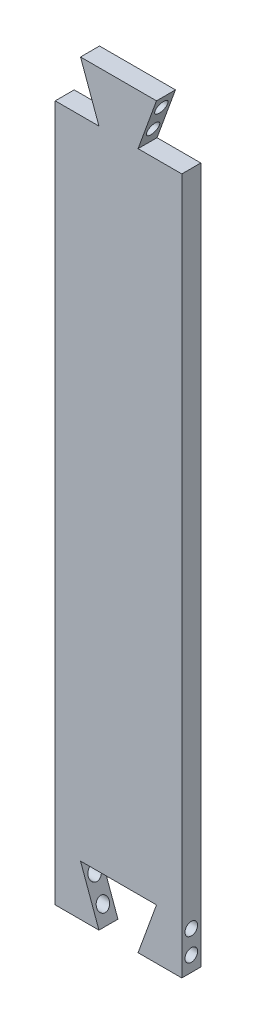
ISO-10303-21;
HEADER;
FILE_DESCRIPTION(('STEP AP214'),'2;1');
FILE_NAME('part.step','',(''),(''),'','','');
FILE_SCHEMA(('AUTOMOTIVE_DESIGN { 1 0 10303 214 1 1 1 1 }'));
ENDSEC;
DATA;
#1=APPLICATION_CONTEXT('core data for automotive mechanical design processes');
#2=APPLICATION_PROTOCOL_DEFINITION('international standard','automotive_design',2000,#1);
#3=PRODUCT_CONTEXT('',#1,'mechanical');
#4=PRODUCT('Part','Part','',(#3));
#5=PRODUCT_RELATED_PRODUCT_CATEGORY('part','',(#4));
#6=PRODUCT_DEFINITION_FORMATION('','',#4);
#7=PRODUCT_DEFINITION_CONTEXT('part definition',#1,'design');
#8=PRODUCT_DEFINITION('design','',#6,#7);
#9=PRODUCT_DEFINITION_SHAPE('','',#8);
#10=(LENGTH_UNIT() NAMED_UNIT(*) SI_UNIT(.MILLI.,.METRE.));
#11=(NAMED_UNIT(*) PLANE_ANGLE_UNIT() SI_UNIT($,.RADIAN.));
#12=(NAMED_UNIT(*) SI_UNIT($,.STERADIAN.) SOLID_ANGLE_UNIT());
#13=UNCERTAINTY_MEASURE_WITH_UNIT(LENGTH_MEASURE(1.E-05),#10,'distance_accuracy_value','');
#14=(GEOMETRIC_REPRESENTATION_CONTEXT(3) GLOBAL_UNCERTAINTY_ASSIGNED_CONTEXT((#13)) GLOBAL_UNIT_ASSIGNED_CONTEXT((#10,
#11,#12)) REPRESENTATION_CONTEXT('',''));
#15=CARTESIAN_POINT('',(0.,0.,0.));
#16=DIRECTION('',(0.,0.,1.));
#17=DIRECTION('',(1.,0.,0.));
#18=AXIS2_PLACEMENT_3D('',#15,#16,#17);
#19=CARTESIAN_POINT('',(0.,-275.,7.5));
#20=DIRECTION('',(0.,1.,0.));
#21=DIRECTION('',(0.,0.,1.));
#22=AXIS2_PLACEMENT_3D('',#19,#20,#21);
#23=PLANE('',#22);
#24=DIRECTION('',(1.,0.,0.));
#25=VECTOR('',#24,1.);
#26=CARTESIAN_POINT('',(0.,-275.,0.));
#27=LINE('',#26,#25);
#28=CARTESIAN_POINT('',(0.,-275.,0.));
#29=VERTEX_POINT('',#28);
#30=CARTESIAN_POINT('',(17.2794046853243,-275.,0.));
#31=VERTEX_POINT('',#30);
#32=EDGE_CURVE('E162',#29,#31,#27,.T.);
#33=ORIENTED_EDGE('',*,*,#32,.T.);
#34=DIRECTION('',(0.,0.,1.));
#35=VECTOR('',#34,1.);
#36=CARTESIAN_POINT('',(17.2794046853243,-275.,-0.00100000000000013));
#37=LINE('',#36,#35);
#38=CARTESIAN_POINT('',(17.2794046853243,-275.,7.5));
#39=VERTEX_POINT('',#38);
#40=EDGE_CURVE('E145',#31,#39,#37,.T.);
#41=ORIENTED_EDGE('',*,*,#40,.T.);
#42=DIRECTION('',(1.,0.,0.));
#43=VECTOR('',#42,1.);
#44=CARTESIAN_POINT('',(0.,-275.,7.5));
#45=LINE('',#44,#43);
#46=CARTESIAN_POINT('',(0.,-275.,7.5));
#47=VERTEX_POINT('',#46);
#48=EDGE_CURVE('E296',#47,#39,#45,.T.);
#49=ORIENTED_EDGE('',*,*,#48,.F.);
#50=DIRECTION('',(0.,0.,-1.));
#51=VECTOR('',#50,1.);
#52=CARTESIAN_POINT('',(0.,-275.,7.5));
#53=LINE('',#52,#51);
#54=EDGE_CURVE('E11',#47,#29,#53,.T.);
#55=ORIENTED_EDGE('',*,*,#54,.T.);
#56=EDGE_LOOP('',(#33,#41,#49,#55));
#57=FACE_BOUND('',#56,.T.);
#58=ADVANCED_FACE('F42',(#57),#23,.F.);
#59=CARTESIAN_POINT('',(0.,0.,7.5));
#60=DIRECTION('',(0.,-1.,0.));
#61=DIRECTION('',(0.,0.,-1.));
#62=AXIS2_PLACEMENT_3D('',#59,#60,#61);
#63=PLANE('',#62);
#64=DIRECTION('',(0.,0.,1.));
#65=VECTOR('',#64,1.);
#66=CARTESIAN_POINT('',(17.279404685324,0.,-36.0555127546398));
#67=LINE('',#66,#65);
#68=CARTESIAN_POINT('',(17.279404685324,0.,0.));
#69=VERTEX_POINT('',#68);
#70=CARTESIAN_POINT('',(17.279404685324,0.,7.5));
#71=VERTEX_POINT('',#70);
#72=EDGE_CURVE('E265',#69,#71,#67,.T.);
#73=ORIENTED_EDGE('',*,*,#72,.F.);
#74=DIRECTION('',(-1.,0.,0.));
#75=VECTOR('',#74,1.);
#76=CARTESIAN_POINT('',(0.,0.,0.));
#77=LINE('',#76,#75);
#78=CARTESIAN_POINT('',(0.,0.,0.));
#79=VERTEX_POINT('',#78);
#80=EDGE_CURVE('E175',#69,#79,#77,.T.);
#81=ORIENTED_EDGE('',*,*,#80,.T.);
#82=DIRECTION('',(0.,0.,-1.));
#83=VECTOR('',#82,1.);
#84=CARTESIAN_POINT('',(0.,0.,7.5));
#85=LINE('',#84,#83);
#86=CARTESIAN_POINT('',(0.,0.,7.5));
#87=VERTEX_POINT('',#86);
#88=EDGE_CURVE('E180',#87,#79,#85,.T.);
#89=ORIENTED_EDGE('',*,*,#88,.F.);
#90=DIRECTION('',(-1.,0.,0.));
#91=VECTOR('',#90,1.);
#92=CARTESIAN_POINT('',(0.,0.,7.5));
#93=LINE('',#92,#91);
#94=EDGE_CURVE('E302',#71,#87,#93,.T.);
#95=ORIENTED_EDGE('',*,*,#94,.F.);
#96=EDGE_LOOP('',(#73,#81,#89,#95));
#97=FACE_BOUND('',#96,.T.);
#98=ADVANCED_FACE('F314',(#97),#63,.F.);
#99=CARTESIAN_POINT('',(0.,0.,7.5));
#100=DIRECTION('',(1.,0.,0.));
#101=DIRECTION('',(0.,1.,0.));
#102=AXIS2_PLACEMENT_3D('',#99,#100,#101);
#103=PLANE('',#102);
#104=CARTESIAN_POINT('',(0.,-269.,3.75));
#105=DIRECTION('',(1.,0.,0.));
#106=DIRECTION('',(0.,1.,0.));
#107=AXIS2_PLACEMENT_3D('',#104,#105,#106);
#108=CIRCLE('',#107,2.5);
#109=CARTESIAN_POINT('',(0.,-266.5,3.75));
#110=VERTEX_POINT('',#109);
#111=EDGE_CURVE('E227',#110,#110,#108,.T.);
#112=ORIENTED_EDGE('',*,*,#111,.T.);
#113=EDGE_LOOP('',(#112));
#114=FACE_BOUND('',#113,.T.);
#115=CARTESIAN_POINT('',(0.,-260.,3.75));
#116=DIRECTION('',(1.,0.,0.));
#117=DIRECTION('',(0.,1.,0.));
#118=AXIS2_PLACEMENT_3D('',#115,#116,#117);
#119=CIRCLE('',#118,2.5);
#120=CARTESIAN_POINT('',(0.,-257.5,3.75));
#121=VERTEX_POINT('',#120);
#122=EDGE_CURVE('E209',#121,#121,#119,.T.);
#123=ORIENTED_EDGE('',*,*,#122,.T.);
#124=EDGE_LOOP('',(#123));
#125=FACE_BOUND('',#124,.T.);
#126=DIRECTION('',(0.,-1.,0.));
#127=VECTOR('',#126,1.);
#128=CARTESIAN_POINT('',(0.,0.,0.));
#129=LINE('',#128,#127);
#130=EDGE_CURVE('E163',#79,#29,#129,.T.);
#131=ORIENTED_EDGE('',*,*,#130,.T.);
#132=ORIENTED_EDGE('',*,*,#54,.F.);
#133=DIRECTION('',(0.,-1.,0.));
#134=VECTOR('',#133,1.);
#135=CARTESIAN_POINT('',(0.,0.,7.5));
#136=LINE('',#135,#134);
#137=EDGE_CURVE('E179',#87,#47,#136,.T.);
#138=ORIENTED_EDGE('',*,*,#137,.F.);
#139=ORIENTED_EDGE('',*,*,#88,.T.);
#140=EDGE_LOOP('',(#131,#132,#138,#139));
#141=FACE_BOUND('',#140,.T.);
#142=ADVANCED_FACE('F44',(#114,#125,#141),#103,.F.);
#143=CARTESIAN_POINT('',(32.7205953146761,-275.,7.5));
#144=VERTEX_POINT('',#143);
#145=CARTESIAN_POINT('',(50.,-275.,7.5));
#146=VERTEX_POINT('',#145);
#147=EDGE_CURVE('E153',#144,#146,#45,.T.);
#148=ORIENTED_EDGE('',*,*,#147,.F.);
#149=DIRECTION('',(0.,0.,1.));
#150=VECTOR('',#149,1.);
#151=CARTESIAN_POINT('',(32.7205953146761,-275.,-0.00100000000000013));
#152=LINE('',#151,#150);
#153=CARTESIAN_POINT('',(32.7205953146761,-275.,0.));
#154=VERTEX_POINT('',#153);
#155=EDGE_CURVE('E138',#154,#144,#152,.T.);
#156=ORIENTED_EDGE('',*,*,#155,.F.);
#157=CARTESIAN_POINT('',(50.,-275.,0.));
#158=VERTEX_POINT('',#157);
#159=EDGE_CURVE('E151',#154,#158,#27,.T.);
#160=ORIENTED_EDGE('',*,*,#159,.T.);
#161=DIRECTION('',(0.,0.,-1.));
#162=VECTOR('',#161,1.);
#163=CARTESIAN_POINT('',(50.,-275.,7.5));
#164=LINE('',#163,#162);
#165=EDGE_CURVE('E52',#146,#158,#164,.T.);
#166=ORIENTED_EDGE('',*,*,#165,.F.);
#167=EDGE_LOOP('',(#148,#156,#160,#166));
#168=FACE_BOUND('',#167,.T.);
#169=ADVANCED_FACE('F149',(#168),#23,.F.);
#170=CARTESIAN_POINT('',(50.,0.,7.5));
#171=DIRECTION('',(-1.,0.,0.));
#172=DIRECTION('',(0.,-1.,0.));
#173=AXIS2_PLACEMENT_3D('',#170,#171,#172);
#174=PLANE('',#173);
#175=CARTESIAN_POINT('',(50.0000000000001,-269.,3.75));
#176=DIRECTION('',(-1.,0.,0.));
#177=DIRECTION('',(0.,-1.,0.));
#178=AXIS2_PLACEMENT_3D('',#175,#176,#177);
#179=CIRCLE('',#178,2.5);
#180=CARTESIAN_POINT('',(50.0000000000001,-271.5,3.75));
#181=VERTEX_POINT('',#180);
#182=EDGE_CURVE('E203',#181,#181,#179,.T.);
#183=ORIENTED_EDGE('',*,*,#182,.T.);
#184=EDGE_LOOP('',(#183));
#185=FACE_BOUND('',#184,.T.);
#186=CARTESIAN_POINT('',(50.0000000000001,-260.,3.75));
#187=DIRECTION('',(-1.,0.,0.));
#188=DIRECTION('',(0.,-1.,0.));
#189=AXIS2_PLACEMENT_3D('',#186,#187,#188);
#190=CIRCLE('',#189,2.5);
#191=CARTESIAN_POINT('',(50.0000000000001,-262.5,3.75));
#192=VERTEX_POINT('',#191);
#193=EDGE_CURVE('E212',#192,#192,#190,.T.);
#194=ORIENTED_EDGE('',*,*,#193,.T.);
#195=EDGE_LOOP('',(#194));
#196=FACE_BOUND('',#195,.T.);
#197=DIRECTION('',(0.,1.,0.));
#198=VECTOR('',#197,1.);
#199=CARTESIAN_POINT('',(50.,0.,0.));
#200=LINE('',#199,#198);
#201=CARTESIAN_POINT('',(50.,0.,0.));
#202=VERTEX_POINT('',#201);
#203=EDGE_CURVE('E160',#158,#202,#200,.T.);
#204=ORIENTED_EDGE('',*,*,#203,.T.);
#205=DIRECTION('',(0.,0.,-1.));
#206=VECTOR('',#205,1.);
#207=CARTESIAN_POINT('',(50.,0.,7.5));
#208=LINE('',#207,#206);
#209=CARTESIAN_POINT('',(50.,0.,7.5));
#210=VERTEX_POINT('',#209);
#211=EDGE_CURVE('E184',#210,#202,#208,.T.);
#212=ORIENTED_EDGE('',*,*,#211,.F.);
#213=DIRECTION('',(0.,1.,0.));
#214=VECTOR('',#213,1.);
#215=CARTESIAN_POINT('',(50.,0.,7.5));
#216=LINE('',#215,#214);
#217=EDGE_CURVE('E300',#146,#210,#216,.T.);
#218=ORIENTED_EDGE('',*,*,#217,.F.);
#219=ORIENTED_EDGE('',*,*,#165,.T.);
#220=EDGE_LOOP('',(#204,#212,#218,#219));
#221=FACE_BOUND('',#220,.T.);
#222=ADVANCED_FACE('F328',(#185,#196,#221),#174,.F.);
#223=CARTESIAN_POINT('',(32.7205953146761,0.,0.));
#224=VERTEX_POINT('',#223);
#225=EDGE_CURVE('E176',#202,#224,#77,.T.);
#226=ORIENTED_EDGE('',*,*,#225,.T.);
#227=DIRECTION('',(0.,0.,1.));
#228=VECTOR('',#227,1.);
#229=CARTESIAN_POINT('',(32.7205953146761,0.,-36.0555127546398));
#230=LINE('',#229,#228);
#231=CARTESIAN_POINT('',(32.7205953146761,0.,7.5));
#232=VERTEX_POINT('',#231);
#233=EDGE_CURVE('E68',#224,#232,#230,.T.);
#234=ORIENTED_EDGE('',*,*,#233,.T.);
#235=EDGE_CURVE('E185',#210,#232,#93,.T.);
#236=ORIENTED_EDGE('',*,*,#235,.F.);
#237=ORIENTED_EDGE('',*,*,#211,.T.);
#238=EDGE_LOOP('',(#226,#234,#236,#237));
#239=FACE_BOUND('',#238,.T.);
#240=ADVANCED_FACE('F329',(#239),#63,.F.);
#241=CARTESIAN_POINT('',(0.,0.,7.5));
#242=DIRECTION('',(0.,0.,1.));
#243=DIRECTION('',(1.,0.,0.));
#244=AXIS2_PLACEMENT_3D('',#241,#242,#243);
#245=PLANE('',#244);
#246=DIRECTION('',(0.342020143325669,-0.939692620785908,0.));
#247=VECTOR('',#246,1.);
#248=CARTESIAN_POINT('',(17.2794046853243,-275.,7.5));
#249=LINE('',#248,#247);
#250=CARTESIAN_POINT('',(10.0000000000002,-255.,7.5));
#251=VERTEX_POINT('',#250);
#252=EDGE_CURVE('E155',#251,#39,#249,.T.);
#253=ORIENTED_EDGE('',*,*,#252,.F.);
#254=DIRECTION('',(-1.,0.,0.));
#255=VECTOR('',#254,1.);
#256=CARTESIAN_POINT('',(10.0000000000002,-255.,7.5));
#257=LINE('',#256,#255);
#258=CARTESIAN_POINT('',(40.0000000000002,-255.,7.5));
#259=VERTEX_POINT('',#258);
#260=EDGE_CURVE('E240',#259,#251,#257,.T.);
#261=ORIENTED_EDGE('',*,*,#260,.F.);
#262=DIRECTION('',(0.342020143325669,0.939692620785908,0.));
#263=VECTOR('',#262,1.);
#264=CARTESIAN_POINT('',(40.0000000000002,-255.,7.5));
#265=LINE('',#264,#263);
#266=EDGE_CURVE('E237',#144,#259,#265,.T.);
#267=ORIENTED_EDGE('',*,*,#266,.F.);
#268=ORIENTED_EDGE('',*,*,#147,.T.);
#269=ORIENTED_EDGE('',*,*,#217,.T.);
#270=ORIENTED_EDGE('',*,*,#235,.T.);
#271=DIRECTION('',(0.342020143325663,0.939692620785911,0.));
#272=VECTOR('',#271,1.);
#273=CARTESIAN_POINT('',(40.,19.9999999999999,7.5));
#274=LINE('',#273,#272);
#275=CARTESIAN_POINT('',(40.,19.9999999999999,7.5));
#276=VERTEX_POINT('',#275);
#277=EDGE_CURVE('E260',#232,#276,#274,.T.);
#278=ORIENTED_EDGE('',*,*,#277,.T.);
#279=DIRECTION('',(-1.,0.,0.));
#280=VECTOR('',#279,1.);
#281=CARTESIAN_POINT('',(10.,19.9999999999999,7.5));
#282=LINE('',#281,#280);
#283=CARTESIAN_POINT('',(10.,19.9999999999999,7.5));
#284=VERTEX_POINT('',#283);
#285=EDGE_CURVE('E271',#276,#284,#282,.T.);
#286=ORIENTED_EDGE('',*,*,#285,.T.);
#287=DIRECTION('',(0.34202014332567,-0.939692620785908,0.));
#288=VECTOR('',#287,1.);
#289=CARTESIAN_POINT('',(17.279404685324,0.,7.5));
#290=LINE('',#289,#288);
#291=EDGE_CURVE('E275',#284,#71,#290,.T.);
#292=ORIENTED_EDGE('',*,*,#291,.T.);
#293=ORIENTED_EDGE('',*,*,#94,.T.);
#294=ORIENTED_EDGE('',*,*,#137,.T.);
#295=ORIENTED_EDGE('',*,*,#48,.T.);
#296=EDGE_LOOP('',(#253,#261,#267,#268,#269,#270,#278,#286,#292,#293,#294,#295));
#297=FACE_BOUND('',#296,.T.);
#298=ADVANCED_FACE('F309',(#297),#245,.T.);
#299=CARTESIAN_POINT('',(0.,0.,0.));
#300=DIRECTION('',(0.,0.,1.));
#301=DIRECTION('',(1.,0.,0.));
#302=AXIS2_PLACEMENT_3D('',#299,#300,#301);
#303=PLANE('',#302);
#304=DIRECTION('',(1.,0.,0.));
#305=VECTOR('',#304,1.);
#306=CARTESIAN_POINT('',(10.0000000000002,-255.,0.));
#307=LINE('',#306,#305);
#308=CARTESIAN_POINT('',(10.0000000000002,-255.,0.));
#309=VERTEX_POINT('',#308);
#310=CARTESIAN_POINT('',(40.0000000000002,-255.,0.));
#311=VERTEX_POINT('',#310);
#312=EDGE_CURVE('E60',#309,#311,#307,.T.);
#313=ORIENTED_EDGE('',*,*,#312,.F.);
#314=DIRECTION('',(-0.342020143325669,0.939692620785908,0.));
#315=VECTOR('',#314,1.);
#316=CARTESIAN_POINT('',(17.2794046853243,-275.,0.));
#317=LINE('',#316,#315);
#318=EDGE_CURVE('E233',#31,#309,#317,.T.);
#319=ORIENTED_EDGE('',*,*,#318,.F.);
#320=ORIENTED_EDGE('',*,*,#32,.F.);
#321=ORIENTED_EDGE('',*,*,#130,.F.);
#322=ORIENTED_EDGE('',*,*,#80,.F.);
#323=DIRECTION('',(-0.34202014332567,0.939692620785908,0.));
#324=VECTOR('',#323,1.);
#325=CARTESIAN_POINT('',(17.279404685324,0.,0.));
#326=LINE('',#325,#324);
#327=CARTESIAN_POINT('',(10.,19.9999999999999,0.));
#328=VERTEX_POINT('',#327);
#329=EDGE_CURVE('E264',#69,#328,#326,.T.);
#330=ORIENTED_EDGE('',*,*,#329,.T.);
#331=DIRECTION('',(1.,0.,0.));
#332=VECTOR('',#331,1.);
#333=CARTESIAN_POINT('',(10.,19.9999999999999,0.));
#334=LINE('',#333,#332);
#335=CARTESIAN_POINT('',(40.,19.9999999999999,0.));
#336=VERTEX_POINT('',#335);
#337=EDGE_CURVE('E261',#328,#336,#334,.T.);
#338=ORIENTED_EDGE('',*,*,#337,.T.);
#339=DIRECTION('',(-0.342020143325663,-0.939692620785911,0.));
#340=VECTOR('',#339,1.);
#341=CARTESIAN_POINT('',(40.,19.9999999999999,0.));
#342=LINE('',#341,#340);
#343=EDGE_CURVE('E169',#336,#224,#342,.T.);
#344=ORIENTED_EDGE('',*,*,#343,.T.);
#345=ORIENTED_EDGE('',*,*,#225,.F.);
#346=ORIENTED_EDGE('',*,*,#203,.F.);
#347=ORIENTED_EDGE('',*,*,#159,.F.);
#348=DIRECTION('',(-0.342020143325669,-0.939692620785908,0.));
#349=VECTOR('',#348,1.);
#350=CARTESIAN_POINT('',(40.0000000000002,-255.,0.));
#351=LINE('',#350,#349);
#352=EDGE_CURVE('E134',#311,#154,#351,.T.);
#353=ORIENTED_EDGE('',*,*,#352,.F.);
#354=EDGE_LOOP('',(#313,#319,#320,#321,#322,#330,#338,#344,#345,#346,#347,#353));
#355=FACE_BOUND('',#354,.T.);
#356=ADVANCED_FACE('F158',(#355),#303,.F.);
#357=CARTESIAN_POINT('',(17.279404685324,0.,-36.0555127546398));
#358=DIRECTION('',(-0.939692620785908,-0.34202014332567,0.));
#359=DIRECTION('',(0.34202014332567,-0.939692620785908,0.));
#360=AXIS2_PLACEMENT_3D('',#357,#358,#359);
#361=PLANE('',#360);
#362=CARTESIAN_POINT('',(11.819851171331,15.,3.75));
#363=DIRECTION('',(-0.939692620785908,-0.34202014332567,0.));
#364=DIRECTION('',(-0.34202014332567,0.939692620785908,0.));
#365=AXIS2_PLACEMENT_3D('',#362,#363,#364);
#366=ELLIPSE('',#365,2.66044443118978,2.5);
#367=CARTESIAN_POINT('',(10.9099255856655,17.5,3.75));
#368=VERTEX_POINT('',#367);
#369=EDGE_CURVE('E198',#368,#368,#366,.T.);
#370=ORIENTED_EDGE('',*,*,#369,.F.);
#371=EDGE_LOOP('',(#370));
#372=FACE_BOUND('',#371,.T.);
#373=CARTESIAN_POINT('',(15.0955832797268,6.,3.75));
#374=DIRECTION('',(-0.939692620785908,-0.34202014332567,0.));
#375=DIRECTION('',(-0.34202014332567,0.939692620785908,0.));
#376=AXIS2_PLACEMENT_3D('',#373,#374,#375);
#377=ELLIPSE('',#376,2.66044443118978,2.5);
#378=CARTESIAN_POINT('',(14.1856576940613,8.5,3.75));
#379=VERTEX_POINT('',#378);
#380=EDGE_CURVE('E194',#379,#379,#377,.T.);
#381=ORIENTED_EDGE('',*,*,#380,.F.);
#382=EDGE_LOOP('',(#381));
#383=FACE_BOUND('',#382,.T.);
#384=ORIENTED_EDGE('',*,*,#329,.F.);
#385=ORIENTED_EDGE('',*,*,#72,.T.);
#386=ORIENTED_EDGE('',*,*,#291,.F.);
#387=DIRECTION('',(0.,0.,1.));
#388=VECTOR('',#387,1.);
#389=CARTESIAN_POINT('',(10.,19.9999999999999,-36.0555127546398));
#390=LINE('',#389,#388);
#391=EDGE_CURVE('E282',#328,#284,#390,.T.);
#392=ORIENTED_EDGE('',*,*,#391,.F.);
#393=EDGE_LOOP('',(#384,#385,#386,#392));
#394=FACE_BOUND('',#393,.T.);
#395=ADVANCED_FACE('F398',(#372,#383,#394),#361,.T.);
#396=CARTESIAN_POINT('',(10.,19.9999999999999,-36.0555127546398));
#397=DIRECTION('',(0.,1.,0.));
#398=DIRECTION('',(0.,0.,1.));
#399=AXIS2_PLACEMENT_3D('',#396,#397,#398);
#400=PLANE('',#399);
#401=ORIENTED_EDGE('',*,*,#337,.F.);
#402=ORIENTED_EDGE('',*,*,#391,.T.);
#403=ORIENTED_EDGE('',*,*,#285,.F.);
#404=DIRECTION('',(0.,0.,1.));
#405=VECTOR('',#404,1.);
#406=CARTESIAN_POINT('',(40.,19.9999999999999,-36.0555127546398));
#407=LINE('',#406,#405);
#408=EDGE_CURVE('E285',#336,#276,#407,.T.);
#409=ORIENTED_EDGE('',*,*,#408,.F.);
#410=EDGE_LOOP('',(#401,#402,#403,#409));
#411=FACE_BOUND('',#410,.T.);
#412=ADVANCED_FACE('F401',(#411),#400,.T.);
#413=CARTESIAN_POINT('',(40.,19.9999999999999,-36.0555127546398));
#414=DIRECTION('',(0.93969262078591,-0.342020143325663,0.));
#415=DIRECTION('',(0.342020143325663,0.939692620785911,0.));
#416=AXIS2_PLACEMENT_3D('',#413,#414,#415);
#417=PLANE('',#416);
#418=CARTESIAN_POINT('',(38.1801488286691,15.,3.75));
#419=DIRECTION('',(0.93969262078591,-0.342020143325663,0.));
#420=DIRECTION('',(-0.342020143325663,-0.939692620785911,0.));
#421=AXIS2_PLACEMENT_3D('',#418,#419,#420);
#422=ELLIPSE('',#421,2.66044443118978,2.5);
#423=CARTESIAN_POINT('',(37.2702232430036,12.5,3.75));
#424=VERTEX_POINT('',#423);
#425=EDGE_CURVE('E195',#424,#424,#422,.T.);
#426=ORIENTED_EDGE('',*,*,#425,.F.);
#427=EDGE_LOOP('',(#426));
#428=FACE_BOUND('',#427,.T.);
#429=CARTESIAN_POINT('',(34.9044167202733,6.,3.75));
#430=DIRECTION('',(0.93969262078591,-0.342020143325663,0.));
#431=DIRECTION('',(-0.342020143325663,-0.939692620785911,0.));
#432=AXIS2_PLACEMENT_3D('',#429,#430,#431);
#433=ELLIPSE('',#432,2.66044443118978,2.5);
#434=CARTESIAN_POINT('',(33.9944911346078,3.5,3.75));
#435=VERTEX_POINT('',#434);
#436=EDGE_CURVE('E144',#435,#435,#433,.T.);
#437=ORIENTED_EDGE('',*,*,#436,.F.);
#438=EDGE_LOOP('',(#437));
#439=FACE_BOUND('',#438,.T.);
#440=ORIENTED_EDGE('',*,*,#343,.F.);
#441=ORIENTED_EDGE('',*,*,#408,.T.);
#442=ORIENTED_EDGE('',*,*,#277,.F.);
#443=ORIENTED_EDGE('',*,*,#233,.F.);
#444=EDGE_LOOP('',(#440,#441,#442,#443));
#445=FACE_BOUND('',#444,.T.);
#446=ADVANCED_FACE('F396',(#428,#439,#445),#417,.T.);
#447=CARTESIAN_POINT('',(50.,6.,3.75));
#448=DIRECTION('',(-1.,0.,0.));
#449=DIRECTION('',(0.,-1.,0.));
#450=AXIS2_PLACEMENT_3D('',#447,#448,#449);
#451=CYLINDRICAL_SURFACE('',#450,2.5);
#452=ORIENTED_EDGE('',*,*,#380,.T.);
#453=EDGE_LOOP('',(#452));
#454=FACE_BOUND('',#453,.T.);
#455=ORIENTED_EDGE('',*,*,#436,.T.);
#456=EDGE_LOOP('',(#455));
#457=FACE_BOUND('',#456,.T.);
#458=ADVANCED_FACE('F392',(#454,#457),#451,.F.);
#459=CARTESIAN_POINT('',(50.,15.,3.75));
#460=DIRECTION('',(-1.,0.,0.));
#461=DIRECTION('',(0.,-1.,0.));
#462=AXIS2_PLACEMENT_3D('',#459,#460,#461);
#463=CYLINDRICAL_SURFACE('',#462,2.5);
#464=ORIENTED_EDGE('',*,*,#369,.T.);
#465=EDGE_LOOP('',(#464));
#466=FACE_BOUND('',#465,.T.);
#467=ORIENTED_EDGE('',*,*,#425,.T.);
#468=EDGE_LOOP('',(#467));
#469=FACE_BOUND('',#468,.T.);
#470=ADVANCED_FACE('F389',(#466,#469),#463,.F.);
#471=CARTESIAN_POINT('',(17.2794046853243,-275.,-0.00100000000000013));
#472=DIRECTION('',(-0.939692620785908,-0.342020143325669,0.));
#473=DIRECTION('',(0.342020143325669,-0.939692620785908,0.));
#474=AXIS2_PLACEMENT_3D('',#471,#472,#473);
#475=PLANE('',#474);
#476=CARTESIAN_POINT('',(15.0955832797271,-269.,3.75));
#477=DIRECTION('',(-0.939692620785908,-0.342020143325669,0.));
#478=DIRECTION('',(-0.342020143325669,0.939692620785908,0.));
#479=AXIS2_PLACEMENT_3D('',#476,#477,#478);
#480=ELLIPSE('',#479,2.66044443118978,2.5);
#481=CARTESIAN_POINT('',(14.1856576940616,-266.5,3.75));
#482=VERTEX_POINT('',#481);
#483=EDGE_CURVE('E223',#482,#482,#480,.T.);
#484=ORIENTED_EDGE('',*,*,#483,.T.);
#485=EDGE_LOOP('',(#484));
#486=FACE_BOUND('',#485,.T.);
#487=CARTESIAN_POINT('',(11.8198511713312,-260.,3.75));
#488=DIRECTION('',(-0.939692620785908,-0.342020143325669,0.));
#489=DIRECTION('',(-0.342020143325669,0.939692620785908,0.));
#490=AXIS2_PLACEMENT_3D('',#487,#488,#489);
#491=ELLIPSE('',#490,2.66044443118978,2.5);
#492=CARTESIAN_POINT('',(10.9099255856657,-257.5,3.75));
#493=VERTEX_POINT('',#492);
#494=EDGE_CURVE('E202',#493,#493,#491,.T.);
#495=ORIENTED_EDGE('',*,*,#494,.T.);
#496=EDGE_LOOP('',(#495));
#497=FACE_BOUND('',#496,.T.);
#498=ORIENTED_EDGE('',*,*,#318,.T.);
#499=DIRECTION('',(0.,0.,1.));
#500=VECTOR('',#499,1.);
#501=CARTESIAN_POINT('',(10.0000000000002,-255.,-0.00100000000000013));
#502=LINE('',#501,#500);
#503=EDGE_CURVE('E249',#309,#251,#502,.T.);
#504=ORIENTED_EDGE('',*,*,#503,.T.);
#505=ORIENTED_EDGE('',*,*,#252,.T.);
#506=ORIENTED_EDGE('',*,*,#40,.F.);
#507=EDGE_LOOP('',(#498,#504,#505,#506));
#508=FACE_BOUND('',#507,.T.);
#509=ADVANCED_FACE('F321',(#486,#497,#508),#475,.F.);
#510=CARTESIAN_POINT('',(10.0000000000002,-255.,-0.00100000000000013));
#511=DIRECTION('',(0.,1.,0.));
#512=DIRECTION('',(0.,0.,1.));
#513=AXIS2_PLACEMENT_3D('',#510,#511,#512);
#514=PLANE('',#513);
#515=ORIENTED_EDGE('',*,*,#312,.T.);
#516=DIRECTION('',(0.,0.,1.));
#517=VECTOR('',#516,1.);
#518=CARTESIAN_POINT('',(40.0000000000002,-255.,-0.00100000000000013));
#519=LINE('',#518,#517);
#520=EDGE_CURVE('E140',#311,#259,#519,.T.);
#521=ORIENTED_EDGE('',*,*,#520,.T.);
#522=ORIENTED_EDGE('',*,*,#260,.T.);
#523=ORIENTED_EDGE('',*,*,#503,.F.);
#524=EDGE_LOOP('',(#515,#521,#522,#523));
#525=FACE_BOUND('',#524,.T.);
#526=ADVANCED_FACE('F323',(#525),#514,.F.);
#527=CARTESIAN_POINT('',(40.0000000000002,-255.,-0.00100000000000013));
#528=DIRECTION('',(0.939692620785908,-0.342020143325669,0.));
#529=DIRECTION('',(0.342020143325669,0.939692620785908,0.));
#530=AXIS2_PLACEMENT_3D('',#527,#528,#529);
#531=PLANE('',#530);
#532=CARTESIAN_POINT('',(34.9044167202734,-269.,3.75));
#533=DIRECTION('',(0.939692620785908,-0.342020143325669,0.));
#534=DIRECTION('',(-0.342020143325669,-0.939692620785908,0.));
#535=AXIS2_PLACEMENT_3D('',#532,#533,#534);
#536=ELLIPSE('',#535,2.66044443118978,2.5);
#537=CARTESIAN_POINT('',(33.9944911346079,-271.5,3.75));
#538=VERTEX_POINT('',#537);
#539=EDGE_CURVE('E46',#538,#538,#536,.T.);
#540=ORIENTED_EDGE('',*,*,#539,.T.);
#541=EDGE_LOOP('',(#540));
#542=FACE_BOUND('',#541,.T.);
#543=CARTESIAN_POINT('',(38.1801488286692,-260.,3.75));
#544=DIRECTION('',(0.939692620785908,-0.342020143325669,0.));
#545=DIRECTION('',(-0.342020143325669,-0.939692620785908,0.));
#546=AXIS2_PLACEMENT_3D('',#543,#544,#545);
#547=ELLIPSE('',#546,2.66044443118978,2.5);
#548=CARTESIAN_POINT('',(37.2702232430037,-262.5,3.75));
#549=VERTEX_POINT('',#548);
#550=EDGE_CURVE('E199',#549,#549,#547,.T.);
#551=ORIENTED_EDGE('',*,*,#550,.T.);
#552=EDGE_LOOP('',(#551));
#553=FACE_BOUND('',#552,.T.);
#554=ORIENTED_EDGE('',*,*,#352,.T.);
#555=ORIENTED_EDGE('',*,*,#155,.T.);
#556=ORIENTED_EDGE('',*,*,#266,.T.);
#557=ORIENTED_EDGE('',*,*,#520,.F.);
#558=EDGE_LOOP('',(#554,#555,#556,#557));
#559=FACE_BOUND('',#558,.T.);
#560=ADVANCED_FACE('F136',(#542,#553,#559),#531,.F.);
#561=CARTESIAN_POINT('',(50.0000000000001,-260.,3.75));
#562=DIRECTION('',(-1.,0.,0.));
#563=DIRECTION('',(0.,-1.,0.));
#564=AXIS2_PLACEMENT_3D('',#561,#562,#563);
#565=CYLINDRICAL_SURFACE('',#564,2.5);
#566=ORIENTED_EDGE('',*,*,#193,.F.);
#567=EDGE_LOOP('',(#566));
#568=FACE_BOUND('',#567,.T.);
#569=ORIENTED_EDGE('',*,*,#550,.F.);
#570=EDGE_LOOP('',(#569));
#571=FACE_BOUND('',#570,.T.);
#572=ADVANCED_FACE('F362',(#568,#571),#565,.F.);
#573=CARTESIAN_POINT('',(50.0000000000001,-269.,3.75));
#574=DIRECTION('',(-1.,0.,0.));
#575=DIRECTION('',(0.,-1.,0.));
#576=AXIS2_PLACEMENT_3D('',#573,#574,#575);
#577=CYLINDRICAL_SURFACE('',#576,2.5);
#578=ORIENTED_EDGE('',*,*,#182,.F.);
#579=EDGE_LOOP('',(#578));
#580=FACE_BOUND('',#579,.T.);
#581=ORIENTED_EDGE('',*,*,#539,.F.);
#582=EDGE_LOOP('',(#581));
#583=FACE_BOUND('',#582,.T.);
#584=ADVANCED_FACE('F359',(#580,#583),#577,.F.);
#585=ORIENTED_EDGE('',*,*,#494,.F.);
#586=EDGE_LOOP('',(#585));
#587=FACE_BOUND('',#586,.T.);
#588=ORIENTED_EDGE('',*,*,#122,.F.);
#589=EDGE_LOOP('',(#588));
#590=FACE_BOUND('',#589,.T.);
#591=ADVANCED_FACE('F356',(#587,#590),#565,.F.);
#592=ORIENTED_EDGE('',*,*,#483,.F.);
#593=EDGE_LOOP('',(#592));
#594=FACE_BOUND('',#593,.T.);
#595=ORIENTED_EDGE('',*,*,#111,.F.);
#596=EDGE_LOOP('',(#595));
#597=FACE_BOUND('',#596,.T.);
#598=ADVANCED_FACE('F358',(#594,#597),#577,.F.);
#599=CLOSED_SHELL('',(#58,#98,#142,#169,#222,#240,#298,#356,#395,#412,#446,#458,#470,#509,#526,
#560,#572,#584,#591,#598));
#600=MANIFOLD_SOLID_BREP('B2',#599);
#601=ADVANCED_BREP_SHAPE_REPRESENTATION('',(#18,#600),#14);
#602=SHAPE_DEFINITION_REPRESENTATION(#9,#601);
ENDSEC;
END-ISO-10303-21;
